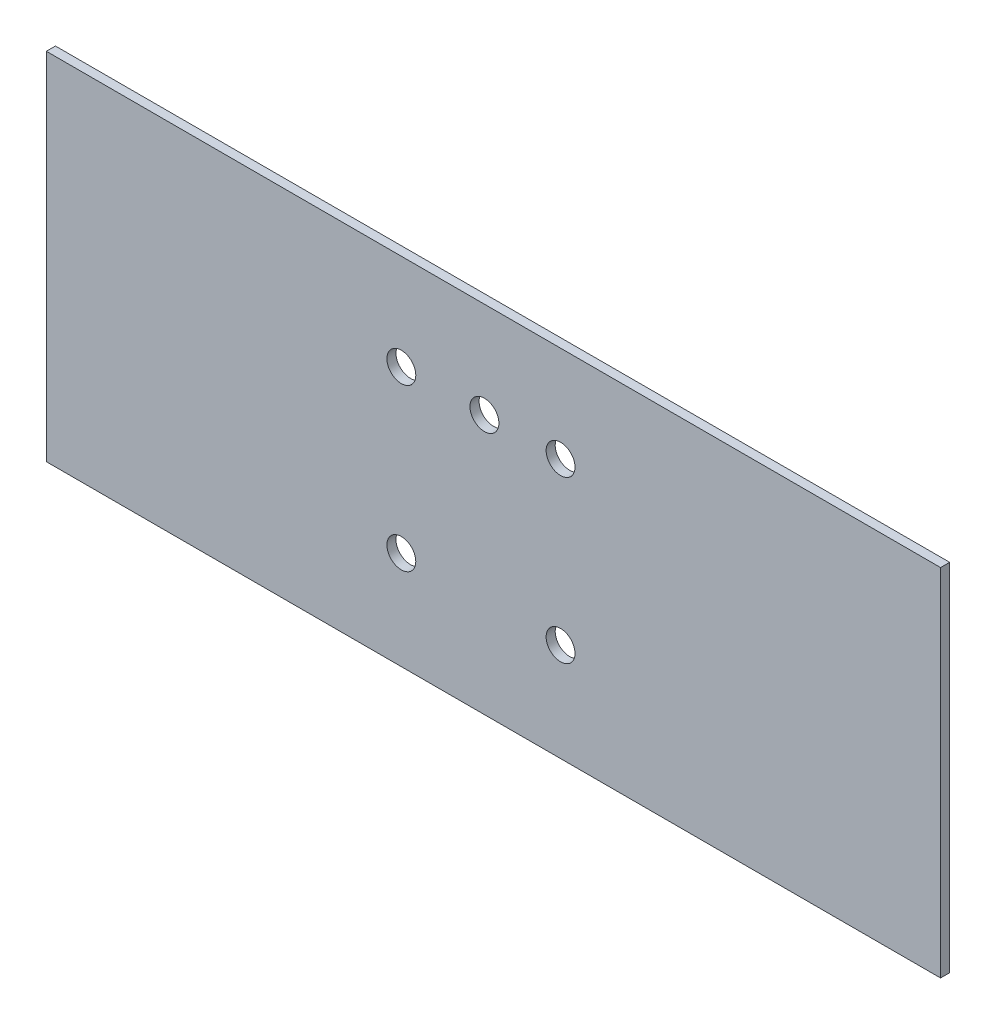
ISO-10303-21;
HEADER;
FILE_DESCRIPTION(('STEP AP214'),'2;1');
FILE_NAME('part.step','',(''),(''),'','','');
FILE_SCHEMA(('AUTOMOTIVE_DESIGN { 1 0 10303 214 1 1 1 1 }'));
ENDSEC;
DATA;
#1=APPLICATION_CONTEXT('core data for automotive mechanical design processes');
#2=APPLICATION_PROTOCOL_DEFINITION('international standard','automotive_design',2000,#1);
#3=PRODUCT_CONTEXT('',#1,'mechanical');
#4=PRODUCT('Part','Part','',(#3));
#5=PRODUCT_RELATED_PRODUCT_CATEGORY('part','',(#4));
#6=PRODUCT_DEFINITION_FORMATION('','',#4);
#7=PRODUCT_DEFINITION_CONTEXT('part definition',#1,'design');
#8=PRODUCT_DEFINITION('design','',#6,#7);
#9=PRODUCT_DEFINITION_SHAPE('','',#8);
#10=(LENGTH_UNIT() NAMED_UNIT(*) SI_UNIT(.MILLI.,.METRE.));
#11=(NAMED_UNIT(*) PLANE_ANGLE_UNIT() SI_UNIT($,.RADIAN.));
#12=(NAMED_UNIT(*) SI_UNIT($,.STERADIAN.) SOLID_ANGLE_UNIT());
#13=UNCERTAINTY_MEASURE_WITH_UNIT(LENGTH_MEASURE(1.E-05),#10,'distance_accuracy_value','');
#14=(GEOMETRIC_REPRESENTATION_CONTEXT(3) GLOBAL_UNCERTAINTY_ASSIGNED_CONTEXT((#13)) GLOBAL_UNIT_ASSIGNED_CONTEXT((#10,
#11,#12)) REPRESENTATION_CONTEXT('',''));
#15=CARTESIAN_POINT('',(0.,0.,0.));
#16=DIRECTION('',(0.,0.,1.));
#17=DIRECTION('',(1.,0.,0.));
#18=AXIS2_PLACEMENT_3D('',#15,#16,#17);
#19=CARTESIAN_POINT('',(0.,0.,4.));
#20=DIRECTION('',(0.,0.,-1.));
#21=DIRECTION('',(-1.,0.,0.));
#22=AXIS2_PLACEMENT_3D('',#19,#20,#21);
#23=PLANE('',#22);
#24=DIRECTION('',(0.,-1.,0.));
#25=VECTOR('',#24,1.);
#26=CARTESIAN_POINT('',(-141.070959797588,-148.208430249585,4.));
#27=LINE('',#26,#25);
#28=CARTESIAN_POINT('',(-141.070959797588,8.06685955291563,4.));
#29=VERTEX_POINT('',#28);
#30=CARTESIAN_POINT('',(-141.070959797588,-148.208430249585,4.));
#31=VERTEX_POINT('',#30);
#32=EDGE_CURVE('E91',#29,#31,#27,.T.);
#33=ORIENTED_EDGE('',*,*,#32,.T.);
#34=DIRECTION('',(1.,0.,0.));
#35=VECTOR('',#34,1.);
#36=CARTESIAN_POINT('',(-141.070959797588,-148.208430249585,4.));
#37=LINE('',#36,#35);
#38=CARTESIAN_POINT('',(252.059066111827,-148.208430249585,4.));
#39=VERTEX_POINT('',#38);
#40=EDGE_CURVE('E86',#31,#39,#37,.T.);
#41=ORIENTED_EDGE('',*,*,#40,.T.);
#42=DIRECTION('',(0.,1.,0.));
#43=VECTOR('',#42,1.);
#44=CARTESIAN_POINT('',(252.059066111827,-148.208430249585,4.));
#45=LINE('',#44,#43);
#46=CARTESIAN_POINT('',(252.059066111827,8.06685955291563,4.));
#47=VERTEX_POINT('',#46);
#48=EDGE_CURVE('E89',#39,#47,#45,.T.);
#49=ORIENTED_EDGE('',*,*,#48,.T.);
#50=DIRECTION('',(-1.,0.,0.));
#51=VECTOR('',#50,1.);
#52=CARTESIAN_POINT('',(-141.070959797588,8.06685955291563,4.));
#53=LINE('',#52,#51);
#54=EDGE_CURVE('E56',#47,#29,#53,.T.);
#55=ORIENTED_EDGE('',*,*,#54,.T.);
#56=EDGE_LOOP('',(#33,#41,#49,#55));
#57=FACE_BOUND('',#56,.T.);
#58=CARTESIAN_POINT('',(51.5321893870748,-34.0898949094365,4.));
#59=DIRECTION('',(0.,0.,1.));
#60=DIRECTION('',(1.,0.,0.));
#61=AXIS2_PLACEMENT_3D('',#58,#59,#60);
#62=CIRCLE('',#61,6.35000000000001);
#63=CARTESIAN_POINT('',(57.8821893870748,-34.0898949094365,4.));
#64=VERTEX_POINT('',#63);
#65=EDGE_CURVE('E106',#64,#64,#62,.T.);
#66=ORIENTED_EDGE('',*,*,#65,.F.);
#67=EDGE_LOOP('',(#66));
#68=FACE_BOUND('',#67,.T.);
#69=CARTESIAN_POINT('',(15.,-105.,4.));
#70=DIRECTION('',(0.,0.,1.));
#71=DIRECTION('',(1.,0.,0.));
#72=AXIS2_PLACEMENT_3D('',#69,#70,#71);
#73=CIRCLE('',#72,6.35);
#74=CARTESIAN_POINT('',(21.35,-105.,4.));
#75=VERTEX_POINT('',#74);
#76=EDGE_CURVE('E121',#75,#75,#73,.T.);
#77=ORIENTED_EDGE('',*,*,#76,.F.);
#78=EDGE_LOOP('',(#77));
#79=FACE_BOUND('',#78,.T.);
#80=CARTESIAN_POINT('',(85.,-105.,4.));
#81=DIRECTION('',(0.,0.,1.));
#82=DIRECTION('',(1.,0.,0.));
#83=AXIS2_PLACEMENT_3D('',#80,#81,#82);
#84=CIRCLE('',#83,6.34999999999999);
#85=CARTESIAN_POINT('',(91.35,-105.,4.));
#86=VERTEX_POINT('',#85);
#87=EDGE_CURVE('E127',#86,#86,#84,.T.);
#88=ORIENTED_EDGE('',*,*,#87,.F.);
#89=EDGE_LOOP('',(#88));
#90=FACE_BOUND('',#89,.T.);
#91=CARTESIAN_POINT('',(85.,-34.0898949094365,4.));
#92=DIRECTION('',(0.,0.,1.));
#93=DIRECTION('',(1.,0.,0.));
#94=AXIS2_PLACEMENT_3D('',#91,#92,#93);
#95=CIRCLE('',#94,6.35);
#96=CARTESIAN_POINT('',(91.35,-34.0898949094365,4.));
#97=VERTEX_POINT('',#96);
#98=EDGE_CURVE('E133',#97,#97,#95,.T.);
#99=ORIENTED_EDGE('',*,*,#98,.F.);
#100=EDGE_LOOP('',(#99));
#101=FACE_BOUND('',#100,.T.);
#102=CARTESIAN_POINT('',(15.,-34.0898949094365,4.));
#103=DIRECTION('',(0.,0.,1.));
#104=DIRECTION('',(1.,0.,0.));
#105=AXIS2_PLACEMENT_3D('',#102,#103,#104);
#106=CIRCLE('',#105,6.35);
#107=CARTESIAN_POINT('',(21.35,-34.0898949094365,4.));
#108=VERTEX_POINT('',#107);
#109=EDGE_CURVE('E139',#108,#108,#106,.T.);
#110=ORIENTED_EDGE('',*,*,#109,.F.);
#111=EDGE_LOOP('',(#110));
#112=FACE_BOUND('',#111,.T.);
#113=ADVANCED_FACE('F39',(#57,#68,#79,#90,#101,#112),#23,.F.);
#114=CARTESIAN_POINT('',(0.,0.,0.));
#115=DIRECTION('',(0.,0.,-1.));
#116=DIRECTION('',(-1.,0.,0.));
#117=AXIS2_PLACEMENT_3D('',#114,#115,#116);
#118=PLANE('',#117);
#119=CARTESIAN_POINT('',(85.,-34.0898949094365,0.));
#120=DIRECTION('',(0.,0.,1.));
#121=DIRECTION('',(1.,0.,0.));
#122=AXIS2_PLACEMENT_3D('',#119,#120,#121);
#123=CIRCLE('',#122,6.35);
#124=CARTESIAN_POINT('',(91.35,-34.0898949094365,0.));
#125=VERTEX_POINT('',#124);
#126=EDGE_CURVE('E136',#125,#125,#123,.T.);
#127=ORIENTED_EDGE('',*,*,#126,.T.);
#128=EDGE_LOOP('',(#127));
#129=FACE_BOUND('',#128,.T.);
#130=CARTESIAN_POINT('',(15.,-105.,0.));
#131=DIRECTION('',(0.,0.,1.));
#132=DIRECTION('',(1.,0.,0.));
#133=AXIS2_PLACEMENT_3D('',#130,#131,#132);
#134=CIRCLE('',#133,6.35);
#135=CARTESIAN_POINT('',(21.35,-105.,0.));
#136=VERTEX_POINT('',#135);
#137=EDGE_CURVE('E124',#136,#136,#134,.T.);
#138=ORIENTED_EDGE('',*,*,#137,.T.);
#139=EDGE_LOOP('',(#138));
#140=FACE_BOUND('',#139,.T.);
#141=DIRECTION('',(0.,-1.,0.));
#142=VECTOR('',#141,1.);
#143=CARTESIAN_POINT('',(-141.070959797588,-148.208430249585,0.));
#144=LINE('',#143,#142);
#145=CARTESIAN_POINT('',(-141.070959797588,8.06685955291563,0.));
#146=VERTEX_POINT('',#145);
#147=CARTESIAN_POINT('',(-141.070959797588,-148.208430249585,0.));
#148=VERTEX_POINT('',#147);
#149=EDGE_CURVE('E103',#146,#148,#144,.T.);
#150=ORIENTED_EDGE('',*,*,#149,.F.);
#151=DIRECTION('',(-1.,0.,0.));
#152=VECTOR('',#151,1.);
#153=CARTESIAN_POINT('',(-141.070959797588,8.06685955291563,0.));
#154=LINE('',#153,#152);
#155=CARTESIAN_POINT('',(252.059066111827,8.06685955291563,0.));
#156=VERTEX_POINT('',#155);
#157=EDGE_CURVE('E79',#156,#146,#154,.T.);
#158=ORIENTED_EDGE('',*,*,#157,.F.);
#159=DIRECTION('',(0.,1.,0.));
#160=VECTOR('',#159,1.);
#161=CARTESIAN_POINT('',(252.059066111827,-148.208430249585,0.));
#162=LINE('',#161,#160);
#163=CARTESIAN_POINT('',(252.059066111827,-148.208430249585,0.));
#164=VERTEX_POINT('',#163);
#165=EDGE_CURVE('E73',#164,#156,#162,.T.);
#166=ORIENTED_EDGE('',*,*,#165,.F.);
#167=DIRECTION('',(1.,0.,0.));
#168=VECTOR('',#167,1.);
#169=CARTESIAN_POINT('',(-141.070959797588,-148.208430249585,0.));
#170=LINE('',#169,#168);
#171=EDGE_CURVE('E95',#148,#164,#170,.T.);
#172=ORIENTED_EDGE('',*,*,#171,.F.);
#173=EDGE_LOOP('',(#150,#158,#166,#172));
#174=FACE_BOUND('',#173,.T.);
#175=CARTESIAN_POINT('',(51.5321893870748,-34.0898949094365,0.));
#176=DIRECTION('',(0.,0.,1.));
#177=DIRECTION('',(1.,0.,0.));
#178=AXIS2_PLACEMENT_3D('',#175,#176,#177);
#179=CIRCLE('',#178,6.35000000000001);
#180=CARTESIAN_POINT('',(57.8821893870748,-34.0898949094365,0.));
#181=VERTEX_POINT('',#180);
#182=EDGE_CURVE('E118',#181,#181,#179,.T.);
#183=ORIENTED_EDGE('',*,*,#182,.T.);
#184=EDGE_LOOP('',(#183));
#185=FACE_BOUND('',#184,.T.);
#186=CARTESIAN_POINT('',(85.,-105.,0.));
#187=DIRECTION('',(0.,0.,1.));
#188=DIRECTION('',(1.,0.,0.));
#189=AXIS2_PLACEMENT_3D('',#186,#187,#188);
#190=CIRCLE('',#189,6.34999999999999);
#191=CARTESIAN_POINT('',(91.35,-105.,0.));
#192=VERTEX_POINT('',#191);
#193=EDGE_CURVE('E130',#192,#192,#190,.T.);
#194=ORIENTED_EDGE('',*,*,#193,.T.);
#195=EDGE_LOOP('',(#194));
#196=FACE_BOUND('',#195,.T.);
#197=CARTESIAN_POINT('',(15.,-34.0898949094365,0.));
#198=DIRECTION('',(0.,0.,1.));
#199=DIRECTION('',(1.,0.,0.));
#200=AXIS2_PLACEMENT_3D('',#197,#198,#199);
#201=CIRCLE('',#200,6.35);
#202=CARTESIAN_POINT('',(21.35,-34.0898949094365,0.));
#203=VERTEX_POINT('',#202);
#204=EDGE_CURVE('E142',#203,#203,#201,.T.);
#205=ORIENTED_EDGE('',*,*,#204,.T.);
#206=EDGE_LOOP('',(#205));
#207=FACE_BOUND('',#206,.T.);
#208=ADVANCED_FACE('F114',(#129,#140,#174,#185,#196,#207),#118,.T.);
#209=CARTESIAN_POINT('',(-141.070959797588,-148.208430249585,4.));
#210=DIRECTION('',(1.,0.,0.));
#211=DIRECTION('',(0.,0.,-1.));
#212=AXIS2_PLACEMENT_3D('',#209,#210,#211);
#213=PLANE('',#212);
#214=ORIENTED_EDGE('',*,*,#149,.T.);
#215=DIRECTION('',(0.,0.,-1.));
#216=VECTOR('',#215,1.);
#217=CARTESIAN_POINT('',(-141.070959797588,-148.208430249585,4.));
#218=LINE('',#217,#216);
#219=EDGE_CURVE('E11',#31,#148,#218,.T.);
#220=ORIENTED_EDGE('',*,*,#219,.F.);
#221=ORIENTED_EDGE('',*,*,#32,.F.);
#222=DIRECTION('',(0.,0.,-1.));
#223=VECTOR('',#222,1.);
#224=CARTESIAN_POINT('',(-141.070959797588,8.06685955291563,4.));
#225=LINE('',#224,#223);
#226=EDGE_CURVE('E99',#29,#146,#225,.T.);
#227=ORIENTED_EDGE('',*,*,#226,.T.);
#228=EDGE_LOOP('',(#214,#220,#221,#227));
#229=FACE_BOUND('',#228,.T.);
#230=ADVANCED_FACE('F41',(#229),#213,.F.);
#231=CARTESIAN_POINT('',(-141.070959797588,-148.208430249585,4.));
#232=DIRECTION('',(0.,1.,0.));
#233=DIRECTION('',(0.,0.,1.));
#234=AXIS2_PLACEMENT_3D('',#231,#232,#233);
#235=PLANE('',#234);
#236=ORIENTED_EDGE('',*,*,#171,.T.);
#237=DIRECTION('',(0.,0.,-1.));
#238=VECTOR('',#237,1.);
#239=CARTESIAN_POINT('',(252.059066111827,-148.208430249585,4.));
#240=LINE('',#239,#238);
#241=EDGE_CURVE('E48',#39,#164,#240,.T.);
#242=ORIENTED_EDGE('',*,*,#241,.F.);
#243=ORIENTED_EDGE('',*,*,#40,.F.);
#244=ORIENTED_EDGE('',*,*,#219,.T.);
#245=EDGE_LOOP('',(#236,#242,#243,#244));
#246=FACE_BOUND('',#245,.T.);
#247=ADVANCED_FACE('F94',(#246),#235,.F.);
#248=CARTESIAN_POINT('',(252.059066111827,-148.208430249585,4.));
#249=DIRECTION('',(-1.,0.,0.));
#250=DIRECTION('',(0.,0.,1.));
#251=AXIS2_PLACEMENT_3D('',#248,#249,#250);
#252=PLANE('',#251);
#253=ORIENTED_EDGE('',*,*,#165,.T.);
#254=DIRECTION('',(0.,0.,-1.));
#255=VECTOR('',#254,1.);
#256=CARTESIAN_POINT('',(252.059066111827,8.06685955291563,4.));
#257=LINE('',#256,#255);
#258=EDGE_CURVE('E96',#47,#156,#257,.T.);
#259=ORIENTED_EDGE('',*,*,#258,.F.);
#260=ORIENTED_EDGE('',*,*,#48,.F.);
#261=ORIENTED_EDGE('',*,*,#241,.T.);
#262=EDGE_LOOP('',(#253,#259,#260,#261));
#263=FACE_BOUND('',#262,.T.);
#264=ADVANCED_FACE('F97',(#263),#252,.F.);
#265=CARTESIAN_POINT('',(-141.070959797588,8.06685955291563,4.));
#266=DIRECTION('',(0.,-1.,0.));
#267=DIRECTION('',(0.,0.,-1.));
#268=AXIS2_PLACEMENT_3D('',#265,#266,#267);
#269=PLANE('',#268);
#270=ORIENTED_EDGE('',*,*,#157,.T.);
#271=ORIENTED_EDGE('',*,*,#226,.F.);
#272=ORIENTED_EDGE('',*,*,#54,.F.);
#273=ORIENTED_EDGE('',*,*,#258,.T.);
#274=EDGE_LOOP('',(#270,#271,#272,#273));
#275=FACE_BOUND('',#274,.T.);
#276=ADVANCED_FACE('F111',(#275),#269,.F.);
#277=CARTESIAN_POINT('',(51.5321893870748,-34.0898949094365,4.));
#278=DIRECTION('',(0.,0.,-1.));
#279=DIRECTION('',(-1.,0.,0.));
#280=AXIS2_PLACEMENT_3D('',#277,#278,#279);
#281=CYLINDRICAL_SURFACE('',#280,6.35000000000001);
#282=ORIENTED_EDGE('',*,*,#65,.T.);
#283=EDGE_LOOP('',(#282));
#284=FACE_BOUND('',#283,.T.);
#285=ORIENTED_EDGE('',*,*,#182,.F.);
#286=EDGE_LOOP('',(#285));
#287=FACE_BOUND('',#286,.T.);
#288=ADVANCED_FACE('F159',(#284,#287),#281,.F.);
#289=CARTESIAN_POINT('',(15.,-105.,4.));
#290=DIRECTION('',(0.,0.,-1.));
#291=DIRECTION('',(-1.,0.,0.));
#292=AXIS2_PLACEMENT_3D('',#289,#290,#291);
#293=CYLINDRICAL_SURFACE('',#292,6.35);
#294=ORIENTED_EDGE('',*,*,#76,.T.);
#295=EDGE_LOOP('',(#294));
#296=FACE_BOUND('',#295,.T.);
#297=ORIENTED_EDGE('',*,*,#137,.F.);
#298=EDGE_LOOP('',(#297));
#299=FACE_BOUND('',#298,.T.);
#300=ADVANCED_FACE('F205',(#296,#299),#293,.F.);
#301=CARTESIAN_POINT('',(85.,-105.,4.));
#302=DIRECTION('',(0.,0.,-1.));
#303=DIRECTION('',(-1.,0.,0.));
#304=AXIS2_PLACEMENT_3D('',#301,#302,#303);
#305=CYLINDRICAL_SURFACE('',#304,6.34999999999999);
#306=ORIENTED_EDGE('',*,*,#87,.T.);
#307=EDGE_LOOP('',(#306));
#308=FACE_BOUND('',#307,.T.);
#309=ORIENTED_EDGE('',*,*,#193,.F.);
#310=EDGE_LOOP('',(#309));
#311=FACE_BOUND('',#310,.T.);
#312=ADVANCED_FACE('F213',(#308,#311),#305,.F.);
#313=CARTESIAN_POINT('',(85.,-34.0898949094365,4.));
#314=DIRECTION('',(0.,0.,-1.));
#315=DIRECTION('',(-1.,0.,0.));
#316=AXIS2_PLACEMENT_3D('',#313,#314,#315);
#317=CYLINDRICAL_SURFACE('',#316,6.35);
#318=ORIENTED_EDGE('',*,*,#98,.T.);
#319=EDGE_LOOP('',(#318));
#320=FACE_BOUND('',#319,.T.);
#321=ORIENTED_EDGE('',*,*,#126,.F.);
#322=EDGE_LOOP('',(#321));
#323=FACE_BOUND('',#322,.T.);
#324=ADVANCED_FACE('F221',(#320,#323),#317,.F.);
#325=CARTESIAN_POINT('',(15.,-34.0898949094365,4.));
#326=DIRECTION('',(0.,0.,-1.));
#327=DIRECTION('',(-1.,0.,0.));
#328=AXIS2_PLACEMENT_3D('',#325,#326,#327);
#329=CYLINDRICAL_SURFACE('',#328,6.35);
#330=ORIENTED_EDGE('',*,*,#109,.T.);
#331=EDGE_LOOP('',(#330));
#332=FACE_BOUND('',#331,.T.);
#333=ORIENTED_EDGE('',*,*,#204,.F.);
#334=EDGE_LOOP('',(#333));
#335=FACE_BOUND('',#334,.T.);
#336=ADVANCED_FACE('F148',(#332,#335),#329,.F.);
#337=CLOSED_SHELL('',(#113,#208,#230,#247,#264,#276,#288,#300,#312,#324,#336));
#338=MANIFOLD_SOLID_BREP('B2',#337);
#339=ADVANCED_BREP_SHAPE_REPRESENTATION('',(#18,#338),#14);
#340=SHAPE_DEFINITION_REPRESENTATION(#9,#339);
ENDSEC;
END-ISO-10303-21;
